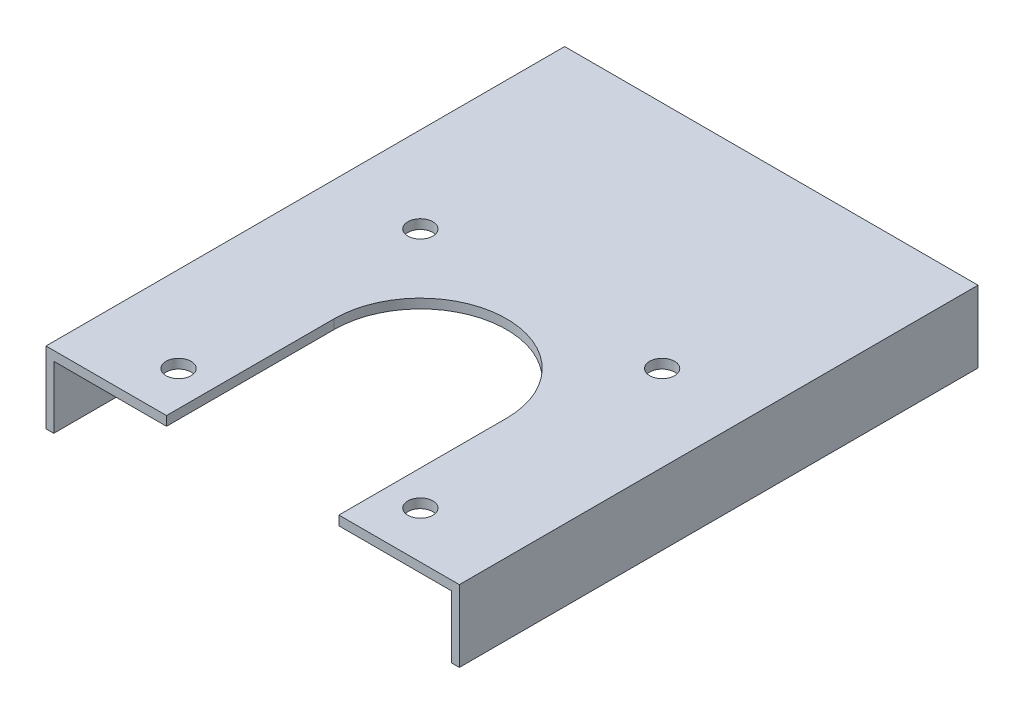
ISO-10303-21;
HEADER;
FILE_DESCRIPTION(('STEP AP214'),'2;1');
FILE_NAME('part.step','',(''),(''),'','','');
FILE_SCHEMA(('AUTOMOTIVE_DESIGN { 1 0 10303 214 1 1 1 1 }'));
ENDSEC;
DATA;
#1=APPLICATION_CONTEXT('core data for automotive mechanical design processes');
#2=APPLICATION_PROTOCOL_DEFINITION('international standard','automotive_design',2000,#1);
#3=PRODUCT_CONTEXT('',#1,'mechanical');
#4=PRODUCT('Part','Part','',(#3));
#5=PRODUCT_RELATED_PRODUCT_CATEGORY('part','',(#4));
#6=PRODUCT_DEFINITION_FORMATION('','',#4);
#7=PRODUCT_DEFINITION_CONTEXT('part definition',#1,'design');
#8=PRODUCT_DEFINITION('design','',#6,#7);
#9=PRODUCT_DEFINITION_SHAPE('','',#8);
#10=(LENGTH_UNIT() NAMED_UNIT(*) SI_UNIT(.MILLI.,.METRE.));
#11=(NAMED_UNIT(*) PLANE_ANGLE_UNIT() SI_UNIT($,.RADIAN.));
#12=(NAMED_UNIT(*) SI_UNIT($,.STERADIAN.) SOLID_ANGLE_UNIT());
#13=UNCERTAINTY_MEASURE_WITH_UNIT(LENGTH_MEASURE(1.E-05),#10,'distance_accuracy_value','');
#14=(GEOMETRIC_REPRESENTATION_CONTEXT(3) GLOBAL_UNCERTAINTY_ASSIGNED_CONTEXT((#13)) GLOBAL_UNIT_ASSIGNED_CONTEXT((#10,
#11,#12)) REPRESENTATION_CONTEXT('',''));
#15=CARTESIAN_POINT('',(0.,0.,0.));
#16=DIRECTION('',(0.,0.,1.));
#17=DIRECTION('',(1.,0.,0.));
#18=AXIS2_PLACEMENT_3D('',#15,#16,#17);
#19=CARTESIAN_POINT('',(26.5,1.2,-21.5));
#20=DIRECTION('',(0.,-1.,0.));
#21=DIRECTION('',(0.,0.,-1.));
#22=AXIS2_PLACEMENT_3D('',#19,#20,#21);
#23=PLANE('',#22);
#24=DIRECTION('',(0.,0.,1.));
#25=VECTOR('',#24,1.);
#26=CARTESIAN_POINT('',(0.,1.2,0.));
#27=LINE('',#26,#25);
#28=CARTESIAN_POINT('',(0.,1.2,-66.5));
#29=VERTEX_POINT('',#28);
#30=CARTESIAN_POINT('',(0.,1.2,0.));
#31=VERTEX_POINT('',#30);
#32=EDGE_CURVE('E177',#29,#31,#27,.T.);
#33=ORIENTED_EDGE('',*,*,#32,.T.);
#34=DIRECTION('',(1.,0.,0.));
#35=VECTOR('',#34,1.);
#36=CARTESIAN_POINT('',(0.,1.2,0.));
#37=LINE('',#36,#35);
#38=CARTESIAN_POINT('',(15.45,1.2,0.));
#39=VERTEX_POINT('',#38);
#40=EDGE_CURVE('E180',#31,#39,#37,.T.);
#41=ORIENTED_EDGE('',*,*,#40,.T.);
#42=DIRECTION('',(0.,0.,-1.));
#43=VECTOR('',#42,1.);
#44=CARTESIAN_POINT('',(15.45,1.2,0.));
#45=LINE('',#44,#43);
#46=CARTESIAN_POINT('',(15.45,1.2,-21.5));
#47=VERTEX_POINT('',#46);
#48=EDGE_CURVE('E183',#39,#47,#45,.T.);
#49=ORIENTED_EDGE('',*,*,#48,.T.);
#50=CARTESIAN_POINT('',(26.5,1.2,-21.5));
#51=DIRECTION('',(0.,-1.,0.));
#52=DIRECTION('',(0.,0.,-1.));
#53=AXIS2_PLACEMENT_3D('',#50,#51,#52);
#54=CIRCLE('',#53,11.05);
#55=CARTESIAN_POINT('',(37.55,1.2,-21.5));
#56=VERTEX_POINT('',#55);
#57=EDGE_CURVE('E185',#47,#56,#54,.T.);
#58=ORIENTED_EDGE('',*,*,#57,.T.);
#59=DIRECTION('',(0.,0.,1.));
#60=VECTOR('',#59,1.);
#61=CARTESIAN_POINT('',(37.55,1.2,0.));
#62=LINE('',#61,#60);
#63=CARTESIAN_POINT('',(37.55,1.2,0.));
#64=VERTEX_POINT('',#63);
#65=EDGE_CURVE('E187',#56,#64,#62,.T.);
#66=ORIENTED_EDGE('',*,*,#65,.T.);
#67=DIRECTION('',(1.,0.,0.));
#68=VECTOR('',#67,1.);
#69=CARTESIAN_POINT('',(37.55,1.2,0.));
#70=LINE('',#69,#68);
#71=CARTESIAN_POINT('',(53.,1.2,0.));
#72=VERTEX_POINT('',#71);
#73=EDGE_CURVE('E189',#64,#72,#70,.T.);
#74=ORIENTED_EDGE('',*,*,#73,.T.);
#75=DIRECTION('',(0.,0.,-1.));
#76=VECTOR('',#75,1.);
#77=CARTESIAN_POINT('',(53.,1.2,0.));
#78=LINE('',#77,#76);
#79=CARTESIAN_POINT('',(53.,1.2,-66.5));
#80=VERTEX_POINT('',#79);
#81=EDGE_CURVE('E191',#72,#80,#78,.T.);
#82=ORIENTED_EDGE('',*,*,#81,.T.);
#83=DIRECTION('',(-1.,0.,0.));
#84=VECTOR('',#83,1.);
#85=CARTESIAN_POINT('',(0.,1.2,-66.5));
#86=LINE('',#85,#84);
#87=EDGE_CURVE('E193',#80,#29,#86,.T.);
#88=ORIENTED_EDGE('',*,*,#87,.T.);
#89=EDGE_LOOP('',(#33,#41,#49,#58,#66,#74,#82,#88));
#90=FACE_BOUND('',#89,.T.);
#91=CARTESIAN_POINT('',(11.,1.2,-6.));
#92=DIRECTION('',(0.,1.,0.));
#93=DIRECTION('',(0.,0.,1.));
#94=AXIS2_PLACEMENT_3D('',#91,#92,#93);
#95=CIRCLE('',#94,1.6);
#96=CARTESIAN_POINT('',(11.,1.2,-4.4));
#97=VERTEX_POINT('',#96);
#98=EDGE_CURVE('E172',#97,#97,#95,.T.);
#99=ORIENTED_EDGE('',*,*,#98,.F.);
#100=EDGE_LOOP('',(#99));
#101=FACE_BOUND('',#100,.T.);
#102=CARTESIAN_POINT('',(11.,1.2,-37.));
#103=DIRECTION('',(0.,1.,0.));
#104=DIRECTION('',(0.,0.,1.));
#105=AXIS2_PLACEMENT_3D('',#102,#103,#104);
#106=CIRCLE('',#105,1.6);
#107=CARTESIAN_POINT('',(11.,1.2,-35.4));
#108=VERTEX_POINT('',#107);
#109=EDGE_CURVE('E166',#108,#108,#106,.T.);
#110=ORIENTED_EDGE('',*,*,#109,.F.);
#111=EDGE_LOOP('',(#110));
#112=FACE_BOUND('',#111,.T.);
#113=CARTESIAN_POINT('',(42.,1.2,-37.));
#114=DIRECTION('',(0.,1.,0.));
#115=DIRECTION('',(0.,0.,-1.));
#116=AXIS2_PLACEMENT_3D('',#113,#114,#115);
#117=CIRCLE('',#116,1.60000000000001);
#118=CARTESIAN_POINT('',(42.,1.2,-38.6));
#119=VERTEX_POINT('',#118);
#120=EDGE_CURVE('E160',#119,#119,#117,.T.);
#121=ORIENTED_EDGE('',*,*,#120,.F.);
#122=EDGE_LOOP('',(#121));
#123=FACE_BOUND('',#122,.T.);
#124=CARTESIAN_POINT('',(42.,1.2,-6.));
#125=DIRECTION('',(0.,1.,0.));
#126=DIRECTION('',(0.,0.,-1.));
#127=AXIS2_PLACEMENT_3D('',#124,#125,#126);
#128=CIRCLE('',#127,1.6);
#129=CARTESIAN_POINT('',(42.,1.2,-7.6));
#130=VERTEX_POINT('',#129);
#131=EDGE_CURVE('E151',#130,#130,#128,.T.);
#132=ORIENTED_EDGE('',*,*,#131,.F.);
#133=EDGE_LOOP('',(#132));
#134=FACE_BOUND('',#133,.T.);
#135=ADVANCED_FACE('F35',(#90,#101,#112,#123,#134),#23,.F.);
#136=CARTESIAN_POINT('',(26.5,0.,-21.5));
#137=DIRECTION('',(0.,-1.,0.));
#138=DIRECTION('',(0.,0.,-1.));
#139=AXIS2_PLACEMENT_3D('',#136,#137,#138);
#140=PLANE('',#139);
#141=DIRECTION('',(0.,0.,-1.));
#142=VECTOR('',#141,1.);
#143=CARTESIAN_POINT('',(52.,0.,-65.5));
#144=LINE('',#143,#142);
#145=CARTESIAN_POINT('',(52.,0.,0.));
#146=VERTEX_POINT('',#145);
#147=CARTESIAN_POINT('',(52.,0.,-65.5));
#148=VERTEX_POINT('',#147);
#149=EDGE_CURVE('E147',#146,#148,#144,.T.);
#150=ORIENTED_EDGE('',*,*,#149,.F.);
#151=DIRECTION('',(1.,0.,0.));
#152=VECTOR('',#151,1.);
#153=CARTESIAN_POINT('',(37.55,0.,0.));
#154=LINE('',#153,#152);
#155=CARTESIAN_POINT('',(37.55,0.,0.));
#156=VERTEX_POINT('',#155);
#157=EDGE_CURVE('E181',#156,#146,#154,.T.);
#158=ORIENTED_EDGE('',*,*,#157,.F.);
#159=DIRECTION('',(0.,0.,1.));
#160=VECTOR('',#159,1.);
#161=CARTESIAN_POINT('',(37.55,0.,0.));
#162=LINE('',#161,#160);
#163=CARTESIAN_POINT('',(37.55,0.,-21.5));
#164=VERTEX_POINT('',#163);
#165=EDGE_CURVE('E201',#164,#156,#162,.T.);
#166=ORIENTED_EDGE('',*,*,#165,.F.);
#167=CARTESIAN_POINT('',(26.5,0.,-21.5));
#168=DIRECTION('',(0.,-1.,0.));
#169=DIRECTION('',(0.,0.,-1.));
#170=AXIS2_PLACEMENT_3D('',#167,#168,#169);
#171=CIRCLE('',#170,11.05);
#172=CARTESIAN_POINT('',(15.45,0.,-21.5));
#173=VERTEX_POINT('',#172);
#174=EDGE_CURVE('E199',#173,#164,#171,.T.);
#175=ORIENTED_EDGE('',*,*,#174,.F.);
#176=DIRECTION('',(0.,0.,-1.));
#177=VECTOR('',#176,1.);
#178=CARTESIAN_POINT('',(15.45,0.,0.));
#179=LINE('',#178,#177);
#180=CARTESIAN_POINT('',(15.45,0.,0.));
#181=VERTEX_POINT('',#180);
#182=EDGE_CURVE('E197',#181,#173,#179,.T.);
#183=ORIENTED_EDGE('',*,*,#182,.F.);
#184=DIRECTION('',(1.,0.,0.));
#185=VECTOR('',#184,1.);
#186=CARTESIAN_POINT('',(0.,0.,0.));
#187=LINE('',#186,#185);
#188=CARTESIAN_POINT('',(1.,0.,0.));
#189=VERTEX_POINT('',#188);
#190=EDGE_CURVE('E58',#189,#181,#187,.T.);
#191=ORIENTED_EDGE('',*,*,#190,.F.);
#192=DIRECTION('',(0.,0.,1.));
#193=VECTOR('',#192,1.);
#194=CARTESIAN_POINT('',(1.,0.,0.));
#195=LINE('',#194,#193);
#196=CARTESIAN_POINT('',(1.00000000000001,0.,-65.5));
#197=VERTEX_POINT('',#196);
#198=EDGE_CURVE('E144',#197,#189,#195,.T.);
#199=ORIENTED_EDGE('',*,*,#198,.F.);
#200=DIRECTION('',(-1.,0.,0.));
#201=VECTOR('',#200,1.);
#202=CARTESIAN_POINT('',(1.00000000000001,0.,-65.5));
#203=LINE('',#202,#201);
#204=EDGE_CURVE('E52',#148,#197,#203,.T.);
#205=ORIENTED_EDGE('',*,*,#204,.F.);
#206=EDGE_LOOP('',(#150,#158,#166,#175,#183,#191,#199,#205));
#207=FACE_BOUND('',#206,.T.);
#208=CARTESIAN_POINT('',(42.,0.,-37.));
#209=DIRECTION('',(0.,1.,0.));
#210=DIRECTION('',(0.,0.,-1.));
#211=AXIS2_PLACEMENT_3D('',#208,#209,#210);
#212=CIRCLE('',#211,1.60000000000001);
#213=CARTESIAN_POINT('',(42.,0.,-38.6));
#214=VERTEX_POINT('',#213);
#215=EDGE_CURVE('E158',#214,#214,#212,.T.);
#216=ORIENTED_EDGE('',*,*,#215,.T.);
#217=EDGE_LOOP('',(#216));
#218=FACE_BOUND('',#217,.T.);
#219=CARTESIAN_POINT('',(11.,0.,-6.));
#220=DIRECTION('',(0.,1.,0.));
#221=DIRECTION('',(0.,0.,1.));
#222=AXIS2_PLACEMENT_3D('',#219,#220,#221);
#223=CIRCLE('',#222,1.6);
#224=CARTESIAN_POINT('',(11.,0.,-4.4));
#225=VERTEX_POINT('',#224);
#226=EDGE_CURVE('E169',#225,#225,#223,.T.);
#227=ORIENTED_EDGE('',*,*,#226,.T.);
#228=EDGE_LOOP('',(#227));
#229=FACE_BOUND('',#228,.T.);
#230=CARTESIAN_POINT('',(11.,0.,-37.));
#231=DIRECTION('',(0.,1.,0.));
#232=DIRECTION('',(0.,0.,1.));
#233=AXIS2_PLACEMENT_3D('',#230,#231,#232);
#234=CIRCLE('',#233,1.6);
#235=CARTESIAN_POINT('',(11.,0.,-35.4));
#236=VERTEX_POINT('',#235);
#237=EDGE_CURVE('E163',#236,#236,#234,.T.);
#238=ORIENTED_EDGE('',*,*,#237,.T.);
#239=EDGE_LOOP('',(#238));
#240=FACE_BOUND('',#239,.T.);
#241=CARTESIAN_POINT('',(42.,0.,-6.));
#242=DIRECTION('',(0.,1.,0.));
#243=DIRECTION('',(0.,0.,-1.));
#244=AXIS2_PLACEMENT_3D('',#241,#242,#243);
#245=CIRCLE('',#244,1.6);
#246=CARTESIAN_POINT('',(42.,0.,-7.6));
#247=VERTEX_POINT('',#246);
#248=EDGE_CURVE('E148',#247,#247,#245,.T.);
#249=ORIENTED_EDGE('',*,*,#248,.T.);
#250=EDGE_LOOP('',(#249));
#251=FACE_BOUND('',#250,.T.);
#252=ADVANCED_FACE('F259',(#207,#218,#229,#240,#251),#140,.T.);
#253=CARTESIAN_POINT('',(0.,1.2,0.));
#254=DIRECTION('',(1.,0.,0.));
#255=DIRECTION('',(0.,0.,-1.));
#256=AXIS2_PLACEMENT_3D('',#253,#254,#255);
#257=PLANE('',#256);
#258=DIRECTION('',(0.,-1.,0.));
#259=VECTOR('',#258,1.);
#260=CARTESIAN_POINT('',(0.,1.2,-66.5));
#261=LINE('',#260,#259);
#262=CARTESIAN_POINT('',(0.,-8.,-66.5));
#263=VERTEX_POINT('',#262);
#264=EDGE_CURVE('E195',#29,#263,#261,.T.);
#265=ORIENTED_EDGE('',*,*,#264,.T.);
#266=DIRECTION('',(0.,0.,-1.));
#267=VECTOR('',#266,1.);
#268=CARTESIAN_POINT('',(0.,-8.,-66.5));
#269=LINE('',#268,#267);
#270=CARTESIAN_POINT('',(0.,-8.,0.));
#271=VERTEX_POINT('',#270);
#272=EDGE_CURVE('E238',#271,#263,#269,.T.);
#273=ORIENTED_EDGE('',*,*,#272,.F.);
#274=DIRECTION('',(0.,-1.,0.));
#275=VECTOR('',#274,1.);
#276=CARTESIAN_POINT('',(0.,1.2,0.));
#277=LINE('',#276,#275);
#278=EDGE_CURVE('E11',#31,#271,#277,.T.);
#279=ORIENTED_EDGE('',*,*,#278,.F.);
#280=ORIENTED_EDGE('',*,*,#32,.F.);
#281=EDGE_LOOP('',(#265,#273,#279,#280));
#282=FACE_BOUND('',#281,.T.);
#283=ADVANCED_FACE('F37',(#282),#257,.F.);
#284=CARTESIAN_POINT('',(0.,1.2,0.));
#285=DIRECTION('',(0.,0.,-1.));
#286=DIRECTION('',(-1.,0.,0.));
#287=AXIS2_PLACEMENT_3D('',#284,#285,#286);
#288=PLANE('',#287);
#289=ORIENTED_EDGE('',*,*,#278,.T.);
#290=DIRECTION('',(-1.,0.,0.));
#291=VECTOR('',#290,1.);
#292=CARTESIAN_POINT('',(0.,-8.,0.));
#293=LINE('',#292,#291);
#294=CARTESIAN_POINT('',(1.,-8.,0.));
#295=VERTEX_POINT('',#294);
#296=EDGE_CURVE('E235',#295,#271,#293,.T.);
#297=ORIENTED_EDGE('',*,*,#296,.F.);
#298=DIRECTION('',(0.,1.,0.));
#299=VECTOR('',#298,1.);
#300=CARTESIAN_POINT('',(1.,-8.,0.));
#301=LINE('',#300,#299);
#302=EDGE_CURVE('E153',#295,#189,#301,.T.);
#303=ORIENTED_EDGE('',*,*,#302,.T.);
#304=ORIENTED_EDGE('',*,*,#190,.T.);
#305=DIRECTION('',(0.,-1.,0.));
#306=VECTOR('',#305,1.);
#307=CARTESIAN_POINT('',(15.45,1.2,0.));
#308=LINE('',#307,#306);
#309=EDGE_CURVE('E44',#39,#181,#308,.T.);
#310=ORIENTED_EDGE('',*,*,#309,.F.);
#311=ORIENTED_EDGE('',*,*,#40,.F.);
#312=EDGE_LOOP('',(#289,#297,#303,#304,#310,#311));
#313=FACE_BOUND('',#312,.T.);
#314=ADVANCED_FACE('F255',(#313),#288,.F.);
#315=CARTESIAN_POINT('',(15.45,1.2,0.));
#316=DIRECTION('',(-1.,0.,0.));
#317=DIRECTION('',(0.,0.,1.));
#318=AXIS2_PLACEMENT_3D('',#315,#316,#317);
#319=PLANE('',#318);
#320=ORIENTED_EDGE('',*,*,#182,.T.);
#321=DIRECTION('',(0.,-1.,0.));
#322=VECTOR('',#321,1.);
#323=CARTESIAN_POINT('',(15.45,1.2,-21.5));
#324=LINE('',#323,#322);
#325=EDGE_CURVE('E216',#47,#173,#324,.T.);
#326=ORIENTED_EDGE('',*,*,#325,.F.);
#327=ORIENTED_EDGE('',*,*,#48,.F.);
#328=ORIENTED_EDGE('',*,*,#309,.T.);
#329=EDGE_LOOP('',(#320,#326,#327,#328));
#330=FACE_BOUND('',#329,.T.);
#331=ADVANCED_FACE('F314',(#330),#319,.F.);
#332=CARTESIAN_POINT('',(26.5,1.2,-21.5));
#333=DIRECTION('',(0.,-1.,0.));
#334=DIRECTION('',(0.,0.,-1.));
#335=AXIS2_PLACEMENT_3D('',#332,#333,#334);
#336=CYLINDRICAL_SURFACE('',#335,11.05);
#337=ORIENTED_EDGE('',*,*,#174,.T.);
#338=DIRECTION('',(0.,-1.,0.));
#339=VECTOR('',#338,1.);
#340=CARTESIAN_POINT('',(37.55,1.2,-21.5));
#341=LINE('',#340,#339);
#342=EDGE_CURVE('E213',#56,#164,#341,.T.);
#343=ORIENTED_EDGE('',*,*,#342,.F.);
#344=ORIENTED_EDGE('',*,*,#57,.F.);
#345=ORIENTED_EDGE('',*,*,#325,.T.);
#346=EDGE_LOOP('',(#337,#343,#344,#345));
#347=FACE_BOUND('',#346,.T.);
#348=ADVANCED_FACE('F310',(#347),#336,.F.);
#349=CARTESIAN_POINT('',(37.55,1.2,0.));
#350=DIRECTION('',(1.,0.,0.));
#351=DIRECTION('',(0.,0.,-1.));
#352=AXIS2_PLACEMENT_3D('',#349,#350,#351);
#353=PLANE('',#352);
#354=ORIENTED_EDGE('',*,*,#165,.T.);
#355=DIRECTION('',(0.,-1.,0.));
#356=VECTOR('',#355,1.);
#357=CARTESIAN_POINT('',(37.55,1.2,0.));
#358=LINE('',#357,#356);
#359=EDGE_CURVE('E210',#64,#156,#358,.T.);
#360=ORIENTED_EDGE('',*,*,#359,.F.);
#361=ORIENTED_EDGE('',*,*,#65,.F.);
#362=ORIENTED_EDGE('',*,*,#342,.T.);
#363=EDGE_LOOP('',(#354,#360,#361,#362));
#364=FACE_BOUND('',#363,.T.);
#365=ADVANCED_FACE('F306',(#364),#353,.F.);
#366=CARTESIAN_POINT('',(37.55,1.2,0.));
#367=DIRECTION('',(0.,0.,-1.));
#368=DIRECTION('',(-1.,0.,0.));
#369=AXIS2_PLACEMENT_3D('',#366,#367,#368);
#370=PLANE('',#369);
#371=ORIENTED_EDGE('',*,*,#157,.T.);
#372=DIRECTION('',(0.,1.,0.));
#373=VECTOR('',#372,1.);
#374=CARTESIAN_POINT('',(52.,-8.,0.));
#375=LINE('',#374,#373);
#376=CARTESIAN_POINT('',(52.,-8.,0.));
#377=VERTEX_POINT('',#376);
#378=EDGE_CURVE('E247',#377,#146,#375,.T.);
#379=ORIENTED_EDGE('',*,*,#378,.F.);
#380=DIRECTION('',(-1.,0.,0.));
#381=VECTOR('',#380,1.);
#382=CARTESIAN_POINT('',(52.,-8.,0.));
#383=LINE('',#382,#381);
#384=CARTESIAN_POINT('',(53.,-8.,0.));
#385=VERTEX_POINT('',#384);
#386=EDGE_CURVE('E140',#385,#377,#383,.T.);
#387=ORIENTED_EDGE('',*,*,#386,.F.);
#388=DIRECTION('',(0.,-1.,0.));
#389=VECTOR('',#388,1.);
#390=CARTESIAN_POINT('',(53.,1.2,0.));
#391=LINE('',#390,#389);
#392=EDGE_CURVE('E208',#72,#385,#391,.T.);
#393=ORIENTED_EDGE('',*,*,#392,.F.);
#394=ORIENTED_EDGE('',*,*,#73,.F.);
#395=ORIENTED_EDGE('',*,*,#359,.T.);
#396=EDGE_LOOP('',(#371,#379,#387,#393,#394,#395));
#397=FACE_BOUND('',#396,.T.);
#398=ADVANCED_FACE('F302',(#397),#370,.F.);
#399=CARTESIAN_POINT('',(53.,1.2,0.));
#400=DIRECTION('',(-1.,0.,0.));
#401=DIRECTION('',(0.,0.,1.));
#402=AXIS2_PLACEMENT_3D('',#399,#400,#401);
#403=PLANE('',#402);
#404=ORIENTED_EDGE('',*,*,#392,.T.);
#405=DIRECTION('',(0.,0.,1.));
#406=VECTOR('',#405,1.);
#407=CARTESIAN_POINT('',(53.,-8.,0.));
#408=LINE('',#407,#406);
#409=CARTESIAN_POINT('',(53.,-8.,-66.5));
#410=VERTEX_POINT('',#409);
#411=EDGE_CURVE('E244',#410,#385,#408,.T.);
#412=ORIENTED_EDGE('',*,*,#411,.F.);
#413=DIRECTION('',(0.,-1.,0.));
#414=VECTOR('',#413,1.);
#415=CARTESIAN_POINT('',(53.,1.2,-66.5));
#416=LINE('',#415,#414);
#417=EDGE_CURVE('E206',#80,#410,#416,.T.);
#418=ORIENTED_EDGE('',*,*,#417,.F.);
#419=ORIENTED_EDGE('',*,*,#81,.F.);
#420=EDGE_LOOP('',(#404,#412,#418,#419));
#421=FACE_BOUND('',#420,.T.);
#422=ADVANCED_FACE('F298',(#421),#403,.F.);
#423=CARTESIAN_POINT('',(0.,1.2,-66.5));
#424=DIRECTION('',(0.,0.,1.));
#425=DIRECTION('',(1.,0.,0.));
#426=AXIS2_PLACEMENT_3D('',#423,#424,#425);
#427=PLANE('',#426);
#428=CARTESIAN_POINT('',(11.5,-4.,-66.5));
#429=DIRECTION('',(0.,0.,-1.));
#430=DIRECTION('',(-1.,0.,0.));
#431=AXIS2_PLACEMENT_3D('',#428,#429,#430);
#432=CIRCLE('',#431,1.6);
#433=CARTESIAN_POINT('',(9.9,-4.,-66.5));
#434=VERTEX_POINT('',#433);
#435=EDGE_CURVE('E222',#434,#434,#432,.T.);
#436=ORIENTED_EDGE('',*,*,#435,.F.);
#437=EDGE_LOOP('',(#436));
#438=FACE_BOUND('',#437,.T.);
#439=CARTESIAN_POINT('',(41.5,-4.,-66.5));
#440=DIRECTION('',(0.,0.,-1.));
#441=DIRECTION('',(1.,0.,0.));
#442=AXIS2_PLACEMENT_3D('',#439,#440,#441);
#443=CIRCLE('',#442,1.60000000000001);
#444=CARTESIAN_POINT('',(43.1,-4.,-66.5));
#445=VERTEX_POINT('',#444);
#446=EDGE_CURVE('E227',#445,#445,#443,.T.);
#447=ORIENTED_EDGE('',*,*,#446,.F.);
#448=EDGE_LOOP('',(#447));
#449=FACE_BOUND('',#448,.T.);
#450=ORIENTED_EDGE('',*,*,#417,.T.);
#451=DIRECTION('',(1.,0.,0.));
#452=VECTOR('',#451,1.);
#453=CARTESIAN_POINT('',(53.,-8.,-66.5));
#454=LINE('',#453,#452);
#455=EDGE_CURVE('E241',#263,#410,#454,.T.);
#456=ORIENTED_EDGE('',*,*,#455,.F.);
#457=ORIENTED_EDGE('',*,*,#264,.F.);
#458=ORIENTED_EDGE('',*,*,#87,.F.);
#459=EDGE_LOOP('',(#450,#456,#457,#458));
#460=FACE_BOUND('',#459,.T.);
#461=ADVANCED_FACE('F295',(#438,#449,#460),#427,.F.);
#462=CARTESIAN_POINT('',(11.,1.2,-6.));
#463=DIRECTION('',(0.,-1.,0.));
#464=DIRECTION('',(0.,0.,-1.));
#465=AXIS2_PLACEMENT_3D('',#462,#463,#464);
#466=CYLINDRICAL_SURFACE('',#465,1.6);
#467=ORIENTED_EDGE('',*,*,#98,.T.);
#468=EDGE_LOOP('',(#467));
#469=FACE_BOUND('',#468,.T.);
#470=ORIENTED_EDGE('',*,*,#226,.F.);
#471=EDGE_LOOP('',(#470));
#472=FACE_BOUND('',#471,.T.);
#473=ADVANCED_FACE('F292',(#469,#472),#466,.F.);
#474=CARTESIAN_POINT('',(11.,1.2,-37.));
#475=DIRECTION('',(0.,-1.,0.));
#476=DIRECTION('',(0.,0.,-1.));
#477=AXIS2_PLACEMENT_3D('',#474,#475,#476);
#478=CYLINDRICAL_SURFACE('',#477,1.6);
#479=ORIENTED_EDGE('',*,*,#109,.T.);
#480=EDGE_LOOP('',(#479));
#481=FACE_BOUND('',#480,.T.);
#482=ORIENTED_EDGE('',*,*,#237,.F.);
#483=EDGE_LOOP('',(#482));
#484=FACE_BOUND('',#483,.T.);
#485=ADVANCED_FACE('F282',(#481,#484),#478,.F.);
#486=CARTESIAN_POINT('',(42.,1.2,-37.));
#487=DIRECTION('',(0.,-1.,0.));
#488=DIRECTION('',(0.,0.,-1.));
#489=AXIS2_PLACEMENT_3D('',#486,#487,#488);
#490=CYLINDRICAL_SURFACE('',#489,1.60000000000001);
#491=ORIENTED_EDGE('',*,*,#120,.T.);
#492=EDGE_LOOP('',(#491));
#493=FACE_BOUND('',#492,.T.);
#494=ORIENTED_EDGE('',*,*,#215,.F.);
#495=EDGE_LOOP('',(#494));
#496=FACE_BOUND('',#495,.T.);
#497=ADVANCED_FACE('F274',(#493,#496),#490,.F.);
#498=CARTESIAN_POINT('',(42.,1.2,-6.));
#499=DIRECTION('',(0.,-1.,0.));
#500=DIRECTION('',(0.,0.,-1.));
#501=AXIS2_PLACEMENT_3D('',#498,#499,#500);
#502=CYLINDRICAL_SURFACE('',#501,1.6);
#503=ORIENTED_EDGE('',*,*,#131,.T.);
#504=EDGE_LOOP('',(#503));
#505=FACE_BOUND('',#504,.T.);
#506=ORIENTED_EDGE('',*,*,#248,.F.);
#507=EDGE_LOOP('',(#506));
#508=FACE_BOUND('',#507,.T.);
#509=ADVANCED_FACE('F272',(#505,#508),#502,.F.);
#510=CARTESIAN_POINT('',(52.,-8.,-65.5));
#511=DIRECTION('',(1.,0.,0.));
#512=DIRECTION('',(0.,0.,-1.));
#513=AXIS2_PLACEMENT_3D('',#510,#511,#512);
#514=PLANE('',#513);
#515=ORIENTED_EDGE('',*,*,#149,.T.);
#516=DIRECTION('',(0.,1.,0.));
#517=VECTOR('',#516,1.);
#518=CARTESIAN_POINT('',(52.,-8.,-65.5));
#519=LINE('',#518,#517);
#520=CARTESIAN_POINT('',(52.,-8.,-65.5));
#521=VERTEX_POINT('',#520);
#522=EDGE_CURVE('E127',#521,#148,#519,.T.);
#523=ORIENTED_EDGE('',*,*,#522,.F.);
#524=DIRECTION('',(0.,0.,-1.));
#525=VECTOR('',#524,1.);
#526=CARTESIAN_POINT('',(52.,-8.,-65.5));
#527=LINE('',#526,#525);
#528=EDGE_CURVE('E134',#377,#521,#527,.T.);
#529=ORIENTED_EDGE('',*,*,#528,.F.);
#530=ORIENTED_EDGE('',*,*,#378,.T.);
#531=EDGE_LOOP('',(#515,#523,#529,#530));
#532=FACE_BOUND('',#531,.T.);
#533=ADVANCED_FACE('F146',(#532),#514,.F.);
#534=CARTESIAN_POINT('',(1.00000000000001,-8.,-65.5));
#535=DIRECTION('',(0.,0.,-1.));
#536=DIRECTION('',(-1.,0.,0.));
#537=AXIS2_PLACEMENT_3D('',#534,#535,#536);
#538=PLANE('',#537);
#539=CARTESIAN_POINT('',(11.5,-4.,-65.5));
#540=DIRECTION('',(0.,0.,-1.));
#541=DIRECTION('',(-1.,0.,0.));
#542=AXIS2_PLACEMENT_3D('',#539,#540,#541);
#543=CIRCLE('',#542,1.6);
#544=CARTESIAN_POINT('',(9.9,-4.,-65.5));
#545=VERTEX_POINT('',#544);
#546=EDGE_CURVE('E39',#545,#545,#543,.T.);
#547=ORIENTED_EDGE('',*,*,#546,.T.);
#548=EDGE_LOOP('',(#547));
#549=FACE_BOUND('',#548,.T.);
#550=CARTESIAN_POINT('',(41.5,-4.,-65.5));
#551=DIRECTION('',(0.,0.,-1.));
#552=DIRECTION('',(-1.,0.,0.));
#553=AXIS2_PLACEMENT_3D('',#550,#551,#552);
#554=CIRCLE('',#553,1.60000000000001);
#555=CARTESIAN_POINT('',(39.9,-4.,-65.5));
#556=VERTEX_POINT('',#555);
#557=EDGE_CURVE('E220',#556,#556,#554,.T.);
#558=ORIENTED_EDGE('',*,*,#557,.T.);
#559=EDGE_LOOP('',(#558));
#560=FACE_BOUND('',#559,.T.);
#561=ORIENTED_EDGE('',*,*,#204,.T.);
#562=DIRECTION('',(0.,1.,0.));
#563=VECTOR('',#562,1.);
#564=CARTESIAN_POINT('',(1.00000000000001,-8.,-65.5));
#565=LINE('',#564,#563);
#566=CARTESIAN_POINT('',(1.00000000000001,-8.,-65.5));
#567=VERTEX_POINT('',#566);
#568=EDGE_CURVE('E130',#567,#197,#565,.T.);
#569=ORIENTED_EDGE('',*,*,#568,.F.);
#570=DIRECTION('',(-1.,0.,0.));
#571=VECTOR('',#570,1.);
#572=CARTESIAN_POINT('',(1.00000000000001,-8.,-65.5));
#573=LINE('',#572,#571);
#574=EDGE_CURVE('E123',#521,#567,#573,.T.);
#575=ORIENTED_EDGE('',*,*,#574,.F.);
#576=ORIENTED_EDGE('',*,*,#522,.T.);
#577=EDGE_LOOP('',(#561,#569,#575,#576));
#578=FACE_BOUND('',#577,.T.);
#579=ADVANCED_FACE('F125',(#549,#560,#578),#538,.F.);
#580=CARTESIAN_POINT('',(1.,-8.,0.));
#581=DIRECTION('',(-1.,0.,0.));
#582=DIRECTION('',(0.,0.,1.));
#583=AXIS2_PLACEMENT_3D('',#580,#581,#582);
#584=PLANE('',#583);
#585=ORIENTED_EDGE('',*,*,#198,.T.);
#586=ORIENTED_EDGE('',*,*,#302,.F.);
#587=DIRECTION('',(0.,0.,1.));
#588=VECTOR('',#587,1.);
#589=CARTESIAN_POINT('',(1.,-8.,0.));
#590=LINE('',#589,#588);
#591=EDGE_CURVE('E133',#567,#295,#590,.T.);
#592=ORIENTED_EDGE('',*,*,#591,.F.);
#593=ORIENTED_EDGE('',*,*,#568,.T.);
#594=EDGE_LOOP('',(#585,#586,#592,#593));
#595=FACE_BOUND('',#594,.T.);
#596=ADVANCED_FACE('F258',(#595),#584,.F.);
#597=CARTESIAN_POINT('',(0.,-8.,0.));
#598=DIRECTION('',(0.,1.,0.));
#599=DIRECTION('',(0.,0.,1.));
#600=AXIS2_PLACEMENT_3D('',#597,#598,#599);
#601=PLANE('',#600);
#602=ORIENTED_EDGE('',*,*,#528,.T.);
#603=ORIENTED_EDGE('',*,*,#574,.T.);
#604=ORIENTED_EDGE('',*,*,#591,.T.);
#605=ORIENTED_EDGE('',*,*,#296,.T.);
#606=ORIENTED_EDGE('',*,*,#272,.T.);
#607=ORIENTED_EDGE('',*,*,#455,.T.);
#608=ORIENTED_EDGE('',*,*,#411,.T.);
#609=ORIENTED_EDGE('',*,*,#386,.T.);
#610=EDGE_LOOP('',(#602,#603,#604,#605,#606,#607,#608,#609));
#611=FACE_BOUND('',#610,.T.);
#612=ADVANCED_FACE('F137',(#611),#601,.F.);
#613=CARTESIAN_POINT('',(41.5,-4.,-58.5));
#614=DIRECTION('',(0.,0.,-1.));
#615=DIRECTION('',(-1.,0.,0.));
#616=AXIS2_PLACEMENT_3D('',#613,#614,#615);
#617=CYLINDRICAL_SURFACE('',#616,1.60000000000001);
#618=ORIENTED_EDGE('',*,*,#446,.T.);
#619=EDGE_LOOP('',(#618));
#620=FACE_BOUND('',#619,.T.);
#621=ORIENTED_EDGE('',*,*,#557,.F.);
#622=EDGE_LOOP('',(#621));
#623=FACE_BOUND('',#622,.T.);
#624=ADVANCED_FACE('F464',(#620,#623),#617,.F.);
#625=CARTESIAN_POINT('',(11.5,-4.,-58.5));
#626=DIRECTION('',(0.,0.,-1.));
#627=DIRECTION('',(-1.,0.,0.));
#628=AXIS2_PLACEMENT_3D('',#625,#626,#627);
#629=CYLINDRICAL_SURFACE('',#628,1.6);
#630=ORIENTED_EDGE('',*,*,#435,.T.);
#631=EDGE_LOOP('',(#630));
#632=FACE_BOUND('',#631,.T.);
#633=ORIENTED_EDGE('',*,*,#546,.F.);
#634=EDGE_LOOP('',(#633));
#635=FACE_BOUND('',#634,.T.);
#636=ADVANCED_FACE('F471',(#632,#635),#629,.F.);
#637=CLOSED_SHELL('',(#135,#252,#283,#314,#331,#348,#365,#398,#422,#461,#473,#485,#497,#509,
#533,#579,#596,#612,#624,#636));
#638=MANIFOLD_SOLID_BREP('B2',#637);
#639=ADVANCED_BREP_SHAPE_REPRESENTATION('',(#18,#638),#14);
#640=SHAPE_DEFINITION_REPRESENTATION(#9,#639);
ENDSEC;
END-ISO-10303-21;
